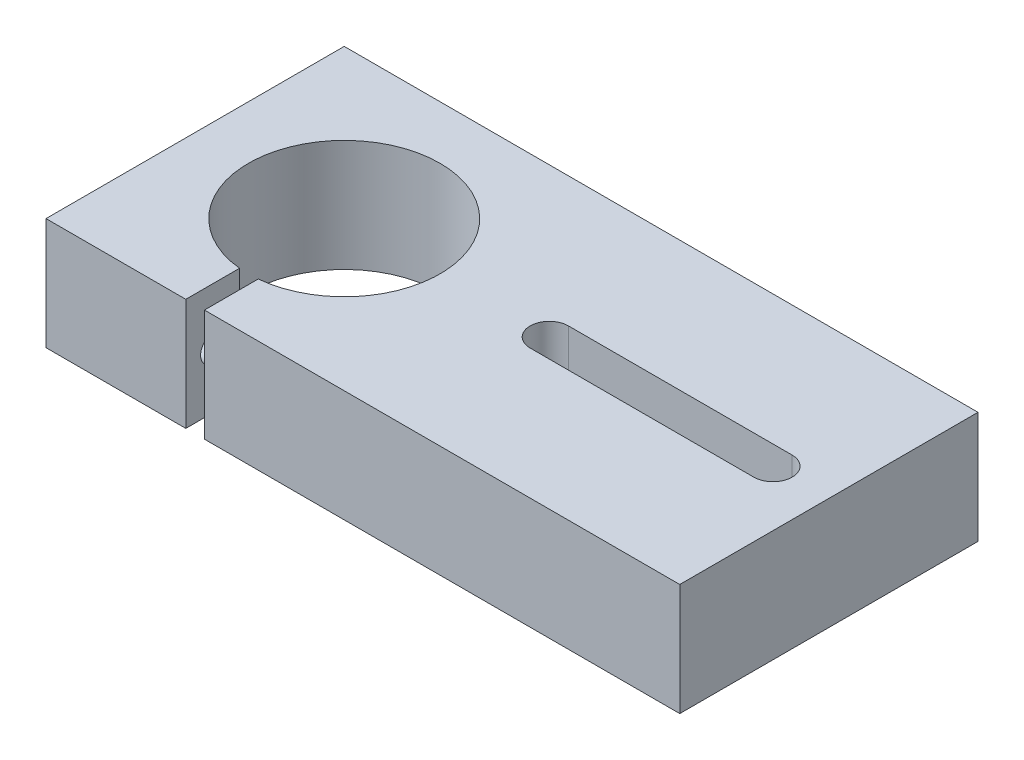
ISO-10303-21;
HEADER;
FILE_DESCRIPTION(('STEP AP214'),'2;1');
FILE_NAME('part.step','',(''),(''),'','','');
FILE_SCHEMA(('AUTOMOTIVE_DESIGN { 1 0 10303 214 1 1 1 1 }'));
ENDSEC;
DATA;
#1=APPLICATION_CONTEXT('core data for automotive mechanical design processes');
#2=APPLICATION_PROTOCOL_DEFINITION('international standard','automotive_design',2000,#1);
#3=PRODUCT_CONTEXT('',#1,'mechanical');
#4=PRODUCT('Part','Part','',(#3));
#5=PRODUCT_RELATED_PRODUCT_CATEGORY('part','',(#4));
#6=PRODUCT_DEFINITION_FORMATION('','',#4);
#7=PRODUCT_DEFINITION_CONTEXT('part definition',#1,'design');
#8=PRODUCT_DEFINITION('design','',#6,#7);
#9=PRODUCT_DEFINITION_SHAPE('','',#8);
#10=(LENGTH_UNIT() NAMED_UNIT(*) SI_UNIT(.MILLI.,.METRE.));
#11=(NAMED_UNIT(*) PLANE_ANGLE_UNIT() SI_UNIT($,.RADIAN.));
#12=(NAMED_UNIT(*) SI_UNIT($,.STERADIAN.) SOLID_ANGLE_UNIT());
#13=UNCERTAINTY_MEASURE_WITH_UNIT(LENGTH_MEASURE(1.E-05),#10,'distance_accuracy_value','');
#14=(GEOMETRIC_REPRESENTATION_CONTEXT(3) GLOBAL_UNCERTAINTY_ASSIGNED_CONTEXT((#13)) GLOBAL_UNIT_ASSIGNED_CONTEXT((#10,
#11,#12)) REPRESENTATION_CONTEXT('',''));
#15=CARTESIAN_POINT('',(0.,0.,0.));
#16=DIRECTION('',(0.,0.,1.));
#17=DIRECTION('',(1.,0.,0.));
#18=AXIS2_PLACEMENT_3D('',#15,#16,#17);
#19=CARTESIAN_POINT('',(-53.975,9.525,25.4));
#20=DIRECTION('',(0.,0.,-1.));
#21=DIRECTION('',(-1.,0.,0.));
#22=AXIS2_PLACEMENT_3D('',#19,#20,#21);
#23=PLANE('',#22);
#24=DIRECTION('',(1.,0.,0.));
#25=VECTOR('',#24,1.);
#26=CARTESIAN_POINT('',(-53.975,9.525,25.4));
#27=LINE('',#26,#25);
#28=CARTESIAN_POINT('',(-26.9875,9.525,25.4));
#29=VERTEX_POINT('',#28);
#30=CARTESIAN_POINT('',(53.975,9.525,25.4));
#31=VERTEX_POINT('',#30);
#32=EDGE_CURVE('E251',#29,#31,#27,.T.);
#33=ORIENTED_EDGE('',*,*,#32,.F.);
#34=DIRECTION('',(0.,1.,0.));
#35=VECTOR('',#34,1.);
#36=CARTESIAN_POINT('',(-26.9875,-9.525,25.4));
#37=LINE('',#36,#35);
#38=CARTESIAN_POINT('',(-26.9875,-9.525,25.4));
#39=VERTEX_POINT('',#38);
#40=EDGE_CURVE('E224',#39,#29,#37,.T.);
#41=ORIENTED_EDGE('',*,*,#40,.F.);
#42=DIRECTION('',(1.,0.,0.));
#43=VECTOR('',#42,1.);
#44=CARTESIAN_POINT('',(-53.975,-9.525,25.4));
#45=LINE('',#44,#43);
#46=CARTESIAN_POINT('',(53.975,-9.525,25.4));
#47=VERTEX_POINT('',#46);
#48=EDGE_CURVE('E268',#39,#47,#45,.T.);
#49=ORIENTED_EDGE('',*,*,#48,.T.);
#50=DIRECTION('',(0.,-1.,0.));
#51=VECTOR('',#50,1.);
#52=CARTESIAN_POINT('',(53.975,9.525,25.4));
#53=LINE('',#52,#51);
#54=EDGE_CURVE('E275',#31,#47,#53,.T.);
#55=ORIENTED_EDGE('',*,*,#54,.F.);
#56=EDGE_LOOP('',(#33,#41,#49,#55));
#57=FACE_BOUND('',#56,.T.);
#58=ADVANCED_FACE('F44',(#57),#23,.F.);
#59=CARTESIAN_POINT('',(-53.975,9.525,25.4));
#60=DIRECTION('',(-1.,0.,0.));
#61=DIRECTION('',(0.,0.,1.));
#62=AXIS2_PLACEMENT_3D('',#59,#60,#61);
#63=PLANE('',#62);
#64=CARTESIAN_POINT('',(-53.975,0.,20.6375));
#65=DIRECTION('',(-1.,0.,0.));
#66=DIRECTION('',(0.,0.,1.));
#67=AXIS2_PLACEMENT_3D('',#64,#65,#66);
#68=CIRCLE('',#67,3.96875);
#69=CARTESIAN_POINT('',(-53.975,0.,24.60625));
#70=VERTEX_POINT('',#69);
#71=EDGE_CURVE('E193',#70,#70,#68,.T.);
#72=ORIENTED_EDGE('',*,*,#71,.F.);
#73=EDGE_LOOP('',(#72));
#74=FACE_BOUND('',#73,.T.);
#75=DIRECTION('',(0.,0.,-1.));
#76=VECTOR('',#75,1.);
#77=CARTESIAN_POINT('',(-53.975,-9.525,25.4));
#78=LINE('',#77,#76);
#79=CARTESIAN_POINT('',(-53.975,-9.525,25.4));
#80=VERTEX_POINT('',#79);
#81=CARTESIAN_POINT('',(-53.975,-9.525,-25.4));
#82=VERTEX_POINT('',#81);
#83=EDGE_CURVE('E235',#80,#82,#78,.T.);
#84=ORIENTED_EDGE('',*,*,#83,.F.);
#85=DIRECTION('',(0.,-1.,0.));
#86=VECTOR('',#85,1.);
#87=CARTESIAN_POINT('',(-53.975,9.525,25.4));
#88=LINE('',#87,#86);
#89=CARTESIAN_POINT('',(-53.975,9.525,25.4));
#90=VERTEX_POINT('',#89);
#91=EDGE_CURVE('E272',#90,#80,#88,.T.);
#92=ORIENTED_EDGE('',*,*,#91,.F.);
#93=DIRECTION('',(0.,0.,-1.));
#94=VECTOR('',#93,1.);
#95=CARTESIAN_POINT('',(-53.975,9.525,25.4));
#96=LINE('',#95,#94);
#97=CARTESIAN_POINT('',(-53.975,9.525,-25.4));
#98=VERTEX_POINT('',#97);
#99=EDGE_CURVE('E239',#90,#98,#96,.T.);
#100=ORIENTED_EDGE('',*,*,#99,.T.);
#101=DIRECTION('',(0.,-1.,0.));
#102=VECTOR('',#101,1.);
#103=CARTESIAN_POINT('',(-53.975,9.525,-25.4));
#104=LINE('',#103,#102);
#105=EDGE_CURVE('E256',#98,#82,#104,.T.);
#106=ORIENTED_EDGE('',*,*,#105,.T.);
#107=EDGE_LOOP('',(#84,#92,#100,#106));
#108=FACE_BOUND('',#107,.T.);
#109=ADVANCED_FACE('F46',(#74,#108),#63,.T.);
#110=CARTESIAN_POINT('',(-30.1625,-9.525,25.4));
#111=VERTEX_POINT('',#110);
#112=EDGE_CURVE('E244',#80,#111,#45,.T.);
#113=ORIENTED_EDGE('',*,*,#112,.T.);
#114=DIRECTION('',(0.,1.,0.));
#115=VECTOR('',#114,1.);
#116=CARTESIAN_POINT('',(-30.1625,-9.525,25.4));
#117=LINE('',#116,#115);
#118=CARTESIAN_POINT('',(-30.1625,9.525,25.4));
#119=VERTEX_POINT('',#118);
#120=EDGE_CURVE('E219',#111,#119,#117,.T.);
#121=ORIENTED_EDGE('',*,*,#120,.T.);
#122=EDGE_CURVE('E252',#90,#119,#27,.T.);
#123=ORIENTED_EDGE('',*,*,#122,.F.);
#124=ORIENTED_EDGE('',*,*,#91,.T.);
#125=EDGE_LOOP('',(#113,#121,#123,#124));
#126=FACE_BOUND('',#125,.T.);
#127=ADVANCED_FACE('F312',(#126),#23,.F.);
#128=CARTESIAN_POINT('',(53.975,9.525,25.4));
#129=DIRECTION('',(-1.,0.,0.));
#130=DIRECTION('',(0.,0.,1.));
#131=AXIS2_PLACEMENT_3D('',#128,#129,#130);
#132=PLANE('',#131);
#133=DIRECTION('',(0.,0.,-1.));
#134=VECTOR('',#133,1.);
#135=CARTESIAN_POINT('',(53.975,-9.525,25.4));
#136=LINE('',#135,#134);
#137=CARTESIAN_POINT('',(53.975,-9.525,-25.4));
#138=VERTEX_POINT('',#137);
#139=EDGE_CURVE('E264',#47,#138,#136,.T.);
#140=ORIENTED_EDGE('',*,*,#139,.T.);
#141=DIRECTION('',(0.,-1.,0.));
#142=VECTOR('',#141,1.);
#143=CARTESIAN_POINT('',(53.975,9.525,-25.4));
#144=LINE('',#143,#142);
#145=CARTESIAN_POINT('',(53.975,9.525,-25.4));
#146=VERTEX_POINT('',#145);
#147=EDGE_CURVE('E279',#146,#138,#144,.T.);
#148=ORIENTED_EDGE('',*,*,#147,.F.);
#149=DIRECTION('',(0.,0.,-1.));
#150=VECTOR('',#149,1.);
#151=CARTESIAN_POINT('',(53.975,9.525,25.4));
#152=LINE('',#151,#150);
#153=EDGE_CURVE('E248',#31,#146,#152,.T.);
#154=ORIENTED_EDGE('',*,*,#153,.F.);
#155=ORIENTED_EDGE('',*,*,#54,.T.);
#156=EDGE_LOOP('',(#140,#148,#154,#155));
#157=FACE_BOUND('',#156,.T.);
#158=ADVANCED_FACE('F319',(#157),#132,.F.);
#159=CARTESIAN_POINT('',(-53.975,9.525,-25.4));
#160=DIRECTION('',(0.,0.,-1.));
#161=DIRECTION('',(-1.,0.,0.));
#162=AXIS2_PLACEMENT_3D('',#159,#160,#161);
#163=PLANE('',#162);
#164=DIRECTION('',(1.,0.,0.));
#165=VECTOR('',#164,1.);
#166=CARTESIAN_POINT('',(-53.975,-9.525,-25.4));
#167=LINE('',#166,#165);
#168=EDGE_CURVE('E260',#82,#138,#167,.T.);
#169=ORIENTED_EDGE('',*,*,#168,.F.);
#170=ORIENTED_EDGE('',*,*,#105,.F.);
#171=DIRECTION('',(1.,0.,0.));
#172=VECTOR('',#171,1.);
#173=CARTESIAN_POINT('',(-53.975,9.525,-25.4));
#174=LINE('',#173,#172);
#175=EDGE_CURVE('E243',#98,#146,#174,.T.);
#176=ORIENTED_EDGE('',*,*,#175,.T.);
#177=ORIENTED_EDGE('',*,*,#147,.T.);
#178=EDGE_LOOP('',(#169,#170,#176,#177));
#179=FACE_BOUND('',#178,.T.);
#180=ADVANCED_FACE('F317',(#179),#163,.T.);
#181=CARTESIAN_POINT('',(0.,9.525,0.));
#182=DIRECTION('',(0.,-1.,0.));
#183=DIRECTION('',(0.,0.,-1.));
#184=AXIS2_PLACEMENT_3D('',#181,#182,#183);
#185=PLANE('',#184);
#186=DIRECTION('',(1.,0.,0.));
#187=VECTOR('',#186,1.);
#188=CARTESIAN_POINT('',(6.34999999999999,9.525,3.26390000000001));
#189=LINE('',#188,#187);
#190=CARTESIAN_POINT('',(6.34999999999999,9.525,3.26390000000001));
#191=VERTEX_POINT('',#190);
#192=CARTESIAN_POINT('',(44.45,9.525,3.2639));
#193=VERTEX_POINT('',#192);
#194=EDGE_CURVE('E171',#191,#193,#189,.T.);
#195=ORIENTED_EDGE('',*,*,#194,.F.);
#196=CARTESIAN_POINT('',(6.34999999999999,9.525,0.));
#197=DIRECTION('',(0.,1.,0.));
#198=DIRECTION('',(0.,0.,1.));
#199=AXIS2_PLACEMENT_3D('',#196,#197,#198);
#200=CIRCLE('',#199,3.26390000000001);
#201=CARTESIAN_POINT('',(6.34999999999999,9.525,-3.26390000000001));
#202=VERTEX_POINT('',#201);
#203=EDGE_CURVE('E60',#202,#191,#200,.T.);
#204=ORIENTED_EDGE('',*,*,#203,.F.);
#205=DIRECTION('',(-1.,0.,0.));
#206=VECTOR('',#205,1.);
#207=CARTESIAN_POINT('',(6.34999999999999,9.525,-3.26390000000001));
#208=LINE('',#207,#206);
#209=CARTESIAN_POINT('',(44.45,9.525,-3.26390000000001));
#210=VERTEX_POINT('',#209);
#211=EDGE_CURVE('E158',#210,#202,#208,.T.);
#212=ORIENTED_EDGE('',*,*,#211,.F.);
#213=CARTESIAN_POINT('',(44.45,9.525,0.));
#214=DIRECTION('',(0.,1.,0.));
#215=DIRECTION('',(0.,0.,1.));
#216=AXIS2_PLACEMENT_3D('',#213,#214,#215);
#217=CIRCLE('',#216,3.26390000000001);
#218=EDGE_CURVE('E162',#193,#210,#217,.T.);
#219=ORIENTED_EDGE('',*,*,#218,.F.);
#220=EDGE_LOOP('',(#195,#204,#212,#219));
#221=FACE_BOUND('',#220,.T.);
#222=CARTESIAN_POINT('',(-28.575,9.525,0.));
#223=DIRECTION('',(0.,1.,0.));
#224=DIRECTION('',(0.,0.,1.));
#225=AXIS2_PLACEMENT_3D('',#222,#223,#224);
#226=CIRCLE('',#225,16.3195);
#227=CARTESIAN_POINT('',(-26.9875,9.525,16.2421034352081));
#228=VERTEX_POINT('',#227);
#229=CARTESIAN_POINT('',(-30.1625,9.525,16.2421034352081));
#230=VERTEX_POINT('',#229);
#231=EDGE_CURVE('E227',#228,#230,#226,.T.);
#232=ORIENTED_EDGE('',*,*,#231,.F.);
#233=DIRECTION('',(0.,0.,-1.));
#234=VECTOR('',#233,1.);
#235=CARTESIAN_POINT('',(-26.9875,9.525,25.4));
#236=LINE('',#235,#234);
#237=EDGE_CURVE('E209',#29,#228,#236,.T.);
#238=ORIENTED_EDGE('',*,*,#237,.F.);
#239=ORIENTED_EDGE('',*,*,#32,.T.);
#240=ORIENTED_EDGE('',*,*,#153,.T.);
#241=ORIENTED_EDGE('',*,*,#175,.F.);
#242=ORIENTED_EDGE('',*,*,#99,.F.);
#243=ORIENTED_EDGE('',*,*,#122,.T.);
#244=DIRECTION('',(0.,0.,1.));
#245=VECTOR('',#244,1.);
#246=CARTESIAN_POINT('',(-30.1625,9.525,25.4));
#247=LINE('',#246,#245);
#248=EDGE_CURVE('E215',#230,#119,#247,.T.);
#249=ORIENTED_EDGE('',*,*,#248,.F.);
#250=EDGE_LOOP('',(#232,#238,#239,#240,#241,#242,#243,#249));
#251=FACE_BOUND('',#250,.T.);
#252=ADVANCED_FACE('F305',(#221,#251),#185,.F.);
#253=CARTESIAN_POINT('',(0.,-9.525,0.));
#254=DIRECTION('',(0.,-1.,0.));
#255=DIRECTION('',(0.,0.,-1.));
#256=AXIS2_PLACEMENT_3D('',#253,#254,#255);
#257=PLANE('',#256);
#258=CARTESIAN_POINT('',(6.34999999999999,-9.525,0.));
#259=DIRECTION('',(0.,1.,0.));
#260=DIRECTION('',(0.,0.,1.));
#261=AXIS2_PLACEMENT_3D('',#258,#259,#260);
#262=CIRCLE('',#261,3.26390000000001);
#263=CARTESIAN_POINT('',(6.34999999999999,-9.525,-3.26390000000001));
#264=VERTEX_POINT('',#263);
#265=CARTESIAN_POINT('',(6.34999999999999,-9.525,3.26390000000001));
#266=VERTEX_POINT('',#265);
#267=EDGE_CURVE('E139',#264,#266,#262,.T.);
#268=ORIENTED_EDGE('',*,*,#267,.T.);
#269=DIRECTION('',(1.,0.,0.));
#270=VECTOR('',#269,1.);
#271=CARTESIAN_POINT('',(6.34999999999999,-9.525,3.26390000000001));
#272=LINE('',#271,#270);
#273=CARTESIAN_POINT('',(44.45,-9.525,3.2639));
#274=VERTEX_POINT('',#273);
#275=EDGE_CURVE('E149',#266,#274,#272,.T.);
#276=ORIENTED_EDGE('',*,*,#275,.T.);
#277=CARTESIAN_POINT('',(44.45,-9.525,0.));
#278=DIRECTION('',(0.,1.,0.));
#279=DIRECTION('',(0.,0.,1.));
#280=AXIS2_PLACEMENT_3D('',#277,#278,#279);
#281=CIRCLE('',#280,3.26390000000001);
#282=CARTESIAN_POINT('',(44.45,-9.525,-3.26390000000001));
#283=VERTEX_POINT('',#282);
#284=EDGE_CURVE('E68',#274,#283,#281,.T.);
#285=ORIENTED_EDGE('',*,*,#284,.T.);
#286=DIRECTION('',(-1.,0.,0.));
#287=VECTOR('',#286,1.);
#288=CARTESIAN_POINT('',(6.34999999999999,-9.525,-3.26390000000001));
#289=LINE('',#288,#287);
#290=EDGE_CURVE('E146',#283,#264,#289,.T.);
#291=ORIENTED_EDGE('',*,*,#290,.T.);
#292=EDGE_LOOP('',(#268,#276,#285,#291));
#293=FACE_BOUND('',#292,.T.);
#294=DIRECTION('',(0.,0.,-1.));
#295=VECTOR('',#294,1.);
#296=CARTESIAN_POINT('',(-26.9875,-9.525,25.4));
#297=LINE('',#296,#295);
#298=CARTESIAN_POINT('',(-26.9875,-9.525,16.2421034352081));
#299=VERTEX_POINT('',#298);
#300=EDGE_CURVE('E210',#39,#299,#297,.T.);
#301=ORIENTED_EDGE('',*,*,#300,.T.);
#302=CARTESIAN_POINT('',(-28.575,-9.525,0.));
#303=DIRECTION('',(0.,1.,0.));
#304=DIRECTION('',(0.,0.,1.));
#305=AXIS2_PLACEMENT_3D('',#302,#303,#304);
#306=CIRCLE('',#305,16.3195);
#307=CARTESIAN_POINT('',(-30.1625,-9.525,16.2421034352081));
#308=VERTEX_POINT('',#307);
#309=EDGE_CURVE('E231',#299,#308,#306,.T.);
#310=ORIENTED_EDGE('',*,*,#309,.T.);
#311=DIRECTION('',(0.,0.,1.));
#312=VECTOR('',#311,1.);
#313=CARTESIAN_POINT('',(-30.1625,-9.525,25.4));
#314=LINE('',#313,#312);
#315=EDGE_CURVE('E214',#308,#111,#314,.T.);
#316=ORIENTED_EDGE('',*,*,#315,.T.);
#317=ORIENTED_EDGE('',*,*,#112,.F.);
#318=ORIENTED_EDGE('',*,*,#83,.T.);
#319=ORIENTED_EDGE('',*,*,#168,.T.);
#320=ORIENTED_EDGE('',*,*,#139,.F.);
#321=ORIENTED_EDGE('',*,*,#48,.F.);
#322=EDGE_LOOP('',(#301,#310,#316,#317,#318,#319,#320,#321));
#323=FACE_BOUND('',#322,.T.);
#324=ADVANCED_FACE('F154',(#293,#323),#257,.T.);
#325=CARTESIAN_POINT('',(-28.575,-9.525,0.));
#326=DIRECTION('',(0.,1.,0.));
#327=DIRECTION('',(0.,0.,1.));
#328=AXIS2_PLACEMENT_3D('',#325,#326,#327);
#329=CYLINDRICAL_SURFACE('',#328,16.3195);
#330=ORIENTED_EDGE('',*,*,#309,.F.);
#331=DIRECTION('',(0.,1.,0.));
#332=VECTOR('',#331,1.);
#333=CARTESIAN_POINT('',(-26.9875,-9.525,16.2421034352081));
#334=LINE('',#333,#332);
#335=EDGE_CURVE('E11',#299,#228,#334,.T.);
#336=ORIENTED_EDGE('',*,*,#335,.T.);
#337=ORIENTED_EDGE('',*,*,#231,.T.);
#338=DIRECTION('',(0.,1.,0.));
#339=VECTOR('',#338,1.);
#340=CARTESIAN_POINT('',(-30.1625,-9.525,16.2421034352081));
#341=LINE('',#340,#339);
#342=EDGE_CURVE('E53',#230,#308,#341,.F.);
#343=ORIENTED_EDGE('',*,*,#342,.T.);
#344=EDGE_LOOP('',(#330,#336,#337,#343));
#345=FACE_BOUND('',#344,.T.);
#346=ADVANCED_FACE('F287',(#345),#329,.F.);
#347=CARTESIAN_POINT('',(-30.1625,-9.525,25.4));
#348=DIRECTION('',(-1.,0.,0.));
#349=DIRECTION('',(0.,0.,1.));
#350=AXIS2_PLACEMENT_3D('',#347,#348,#349);
#351=PLANE('',#350);
#352=CARTESIAN_POINT('',(-30.1625,0.,20.6375));
#353=DIRECTION('',(-1.,0.,0.));
#354=DIRECTION('',(0.,0.,1.));
#355=AXIS2_PLACEMENT_3D('',#352,#353,#354);
#356=CIRCLE('',#355,2.2479);
#357=CARTESIAN_POINT('',(-30.1625,0.,22.8854));
#358=VERTEX_POINT('',#357);
#359=EDGE_CURVE('E205',#358,#358,#356,.T.);
#360=ORIENTED_EDGE('',*,*,#359,.T.);
#361=EDGE_LOOP('',(#360));
#362=FACE_BOUND('',#361,.T.);
#363=ORIENTED_EDGE('',*,*,#248,.T.);
#364=ORIENTED_EDGE('',*,*,#120,.F.);
#365=ORIENTED_EDGE('',*,*,#315,.F.);
#366=ORIENTED_EDGE('',*,*,#342,.F.);
#367=EDGE_LOOP('',(#363,#364,#365,#366));
#368=FACE_BOUND('',#367,.T.);
#369=ADVANCED_FACE('F310',(#362,#368),#351,.F.);
#370=CARTESIAN_POINT('',(-26.9875,-9.525,25.4));
#371=DIRECTION('',(1.,0.,0.));
#372=DIRECTION('',(0.,0.,-1.));
#373=AXIS2_PLACEMENT_3D('',#370,#371,#372);
#374=PLANE('',#373);
#375=CARTESIAN_POINT('',(-26.9875,0.,20.6375));
#376=DIRECTION('',(-1.,0.,0.));
#377=DIRECTION('',(0.,0.,1.));
#378=AXIS2_PLACEMENT_3D('',#375,#376,#377);
#379=CIRCLE('',#378,1.7272);
#380=CARTESIAN_POINT('',(-26.9875,0.,22.3647));
#381=VERTEX_POINT('',#380);
#382=EDGE_CURVE('E180',#381,#381,#379,.T.);
#383=ORIENTED_EDGE('',*,*,#382,.F.);
#384=EDGE_LOOP('',(#383));
#385=FACE_BOUND('',#384,.T.);
#386=ORIENTED_EDGE('',*,*,#300,.F.);
#387=ORIENTED_EDGE('',*,*,#40,.T.);
#388=ORIENTED_EDGE('',*,*,#237,.T.);
#389=ORIENTED_EDGE('',*,*,#335,.F.);
#390=EDGE_LOOP('',(#386,#387,#388,#389));
#391=FACE_BOUND('',#390,.T.);
#392=ADVANCED_FACE('F296',(#385,#391),#374,.F.);
#393=CARTESIAN_POINT('',(-53.975,0.,20.6375));
#394=DIRECTION('',(-1.,0.,0.));
#395=DIRECTION('',(0.,0.,1.));
#396=AXIS2_PLACEMENT_3D('',#393,#394,#395);
#397=CYLINDRICAL_SURFACE('',#396,2.2479);
#398=ORIENTED_EDGE('',*,*,#359,.F.);
#399=EDGE_LOOP('',(#398));
#400=FACE_BOUND('',#399,.T.);
#401=CARTESIAN_POINT('',(-49.8094,0.,20.6375));
#402=DIRECTION('',(-1.,0.,0.));
#403=DIRECTION('',(0.,0.,1.));
#404=AXIS2_PLACEMENT_3D('',#401,#402,#403);
#405=CIRCLE('',#404,2.2479);
#406=CARTESIAN_POINT('',(-49.8094,0.,22.8854));
#407=VERTEX_POINT('',#406);
#408=EDGE_CURVE('E201',#407,#407,#405,.T.);
#409=ORIENTED_EDGE('',*,*,#408,.T.);
#410=EDGE_LOOP('',(#409));
#411=FACE_BOUND('',#410,.T.);
#412=ADVANCED_FACE('F344',(#400,#411),#397,.F.);
#413=CARTESIAN_POINT('',(-49.8094,2.2479,20.6375));
#414=DIRECTION('',(1.,0.,0.));
#415=DIRECTION('',(0.,0.,-1.));
#416=AXIS2_PLACEMENT_3D('',#413,#414,#415);
#417=PLANE('',#416);
#418=ORIENTED_EDGE('',*,*,#408,.F.);
#419=EDGE_LOOP('',(#418));
#420=FACE_BOUND('',#419,.T.);
#421=CARTESIAN_POINT('',(-49.8094,0.,20.6375));
#422=DIRECTION('',(-1.,0.,0.));
#423=DIRECTION('',(0.,0.,1.));
#424=AXIS2_PLACEMENT_3D('',#421,#422,#423);
#425=CIRCLE('',#424,3.96875);
#426=CARTESIAN_POINT('',(-49.8094,0.,24.60625));
#427=VERTEX_POINT('',#426);
#428=EDGE_CURVE('E197',#427,#427,#425,.T.);
#429=ORIENTED_EDGE('',*,*,#428,.T.);
#430=EDGE_LOOP('',(#429));
#431=FACE_BOUND('',#430,.T.);
#432=ADVANCED_FACE('F351',(#420,#431),#417,.F.);
#433=CARTESIAN_POINT('',(-53.975,0.,20.6375));
#434=DIRECTION('',(-1.,0.,0.));
#435=DIRECTION('',(0.,0.,1.));
#436=AXIS2_PLACEMENT_3D('',#433,#434,#435);
#437=CYLINDRICAL_SURFACE('',#436,3.96875);
#438=ORIENTED_EDGE('',*,*,#428,.F.);
#439=EDGE_LOOP('',(#438));
#440=FACE_BOUND('',#439,.T.);
#441=ORIENTED_EDGE('',*,*,#71,.T.);
#442=EDGE_LOOP('',(#441));
#443=FACE_BOUND('',#442,.T.);
#444=ADVANCED_FACE('F355',(#440,#443),#437,.F.);
#445=CARTESIAN_POINT('',(-1.58749999999999,0.,20.6375));
#446=DIRECTION('',(-1.,0.,0.));
#447=DIRECTION('',(0.,0.,1.));
#448=AXIS2_PLACEMENT_3D('',#445,#446,#447);
#449=CONICAL_SURFACE('',#448,1.72719999999999,1.02974425867665);
#450=CARTESIAN_POINT('',(-0.54969353881559,0.,20.6375));
#451=VERTEX_POINT('',#450);
#452=VERTEX_LOOP('',#451);
#453=FACE_BOUND('',#452,.T.);
#454=CARTESIAN_POINT('',(-1.58749999999999,0.,20.6375));
#455=DIRECTION('',(-1.,0.,0.));
#456=DIRECTION('',(0.,0.,1.));
#457=AXIS2_PLACEMENT_3D('',#454,#455,#456);
#458=CIRCLE('',#457,1.72719999999999);
#459=CARTESIAN_POINT('',(-1.58749999999999,0.,22.3647));
#460=VERTEX_POINT('',#459);
#461=EDGE_CURVE('E189',#460,#460,#458,.T.);
#462=ORIENTED_EDGE('',*,*,#461,.T.);
#463=EDGE_LOOP('',(#462));
#464=FACE_BOUND('',#463,.T.);
#465=ADVANCED_FACE('F359',(#453,#464),#449,.F.);
#466=CARTESIAN_POINT('',(-26.9875,0.,20.6375));
#467=DIRECTION('',(-1.,0.,0.));
#468=DIRECTION('',(0.,0.,1.));
#469=AXIS2_PLACEMENT_3D('',#466,#467,#468);
#470=CYLINDRICAL_SURFACE('',#469,1.7272);
#471=ORIENTED_EDGE('',*,*,#461,.F.);
#472=EDGE_LOOP('',(#471));
#473=FACE_BOUND('',#472,.T.);
#474=ORIENTED_EDGE('',*,*,#382,.T.);
#475=EDGE_LOOP('',(#474));
#476=FACE_BOUND('',#475,.T.);
#477=ADVANCED_FACE('F363',(#473,#476),#470,.F.);
#478=CARTESIAN_POINT('',(6.34999999999999,-9.525,0.));
#479=DIRECTION('',(0.,1.,0.));
#480=DIRECTION('',(0.,0.,1.));
#481=AXIS2_PLACEMENT_3D('',#478,#479,#480);
#482=CYLINDRICAL_SURFACE('',#481,3.26390000000001);
#483=ORIENTED_EDGE('',*,*,#203,.T.);
#484=DIRECTION('',(0.,1.,0.));
#485=VECTOR('',#484,1.);
#486=CARTESIAN_POINT('',(6.34999999999999,-9.525,3.26390000000001));
#487=LINE('',#486,#485);
#488=EDGE_CURVE('E135',#266,#191,#487,.T.);
#489=ORIENTED_EDGE('',*,*,#488,.F.);
#490=ORIENTED_EDGE('',*,*,#267,.F.);
#491=DIRECTION('',(0.,1.,0.));
#492=VECTOR('',#491,1.);
#493=CARTESIAN_POINT('',(6.34999999999999,-9.525,-3.26390000000001));
#494=LINE('',#493,#492);
#495=EDGE_CURVE('E177',#264,#202,#494,.T.);
#496=ORIENTED_EDGE('',*,*,#495,.T.);
#497=EDGE_LOOP('',(#483,#489,#490,#496));
#498=FACE_BOUND('',#497,.T.);
#499=ADVANCED_FACE('F137',(#498),#482,.F.);
#500=CARTESIAN_POINT('',(6.34999999999999,-9.525,-3.26390000000001));
#501=DIRECTION('',(0.,0.,-1.));
#502=DIRECTION('',(-1.,0.,0.));
#503=AXIS2_PLACEMENT_3D('',#500,#501,#502);
#504=PLANE('',#503);
#505=ORIENTED_EDGE('',*,*,#211,.T.);
#506=ORIENTED_EDGE('',*,*,#495,.F.);
#507=ORIENTED_EDGE('',*,*,#290,.F.);
#508=DIRECTION('',(0.,1.,0.));
#509=VECTOR('',#508,1.);
#510=CARTESIAN_POINT('',(44.45,-9.525,-3.26390000000001));
#511=LINE('',#510,#509);
#512=EDGE_CURVE('E181',#283,#210,#511,.T.);
#513=ORIENTED_EDGE('',*,*,#512,.T.);
#514=EDGE_LOOP('',(#505,#506,#507,#513));
#515=FACE_BOUND('',#514,.T.);
#516=ADVANCED_FACE('F370',(#515),#504,.F.);
#517=CARTESIAN_POINT('',(44.45,-9.525,0.));
#518=DIRECTION('',(0.,1.,0.));
#519=DIRECTION('',(0.,0.,1.));
#520=AXIS2_PLACEMENT_3D('',#517,#518,#519);
#521=CYLINDRICAL_SURFACE('',#520,3.26390000000001);
#522=ORIENTED_EDGE('',*,*,#218,.T.);
#523=ORIENTED_EDGE('',*,*,#512,.F.);
#524=ORIENTED_EDGE('',*,*,#284,.F.);
#525=DIRECTION('',(0.,1.,0.));
#526=VECTOR('',#525,1.);
#527=CARTESIAN_POINT('',(44.45,-9.525,3.2639));
#528=LINE('',#527,#526);
#529=EDGE_CURVE('E145',#274,#193,#528,.T.);
#530=ORIENTED_EDGE('',*,*,#529,.T.);
#531=EDGE_LOOP('',(#522,#523,#524,#530));
#532=FACE_BOUND('',#531,.T.);
#533=ADVANCED_FACE('F373',(#532),#521,.F.);
#534=CARTESIAN_POINT('',(6.34999999999999,-9.525,3.26390000000001));
#535=DIRECTION('',(0.,0.,1.));
#536=DIRECTION('',(1.,0.,0.));
#537=AXIS2_PLACEMENT_3D('',#534,#535,#536);
#538=PLANE('',#537);
#539=ORIENTED_EDGE('',*,*,#194,.T.);
#540=ORIENTED_EDGE('',*,*,#529,.F.);
#541=ORIENTED_EDGE('',*,*,#275,.F.);
#542=ORIENTED_EDGE('',*,*,#488,.T.);
#543=EDGE_LOOP('',(#539,#540,#541,#542));
#544=FACE_BOUND('',#543,.T.);
#545=ADVANCED_FACE('F150',(#544),#538,.F.);
#546=CLOSED_SHELL('',(#58,#109,#127,#158,#180,#252,#324,#346,#369,#392,#412,#432,#444,#465,#477,
#499,#516,#533,#545));
#547=MANIFOLD_SOLID_BREP('B2',#546);
#548=ADVANCED_BREP_SHAPE_REPRESENTATION('',(#18,#547),#14);
#549=SHAPE_DEFINITION_REPRESENTATION(#9,#548);
ENDSEC;
END-ISO-10303-21;
